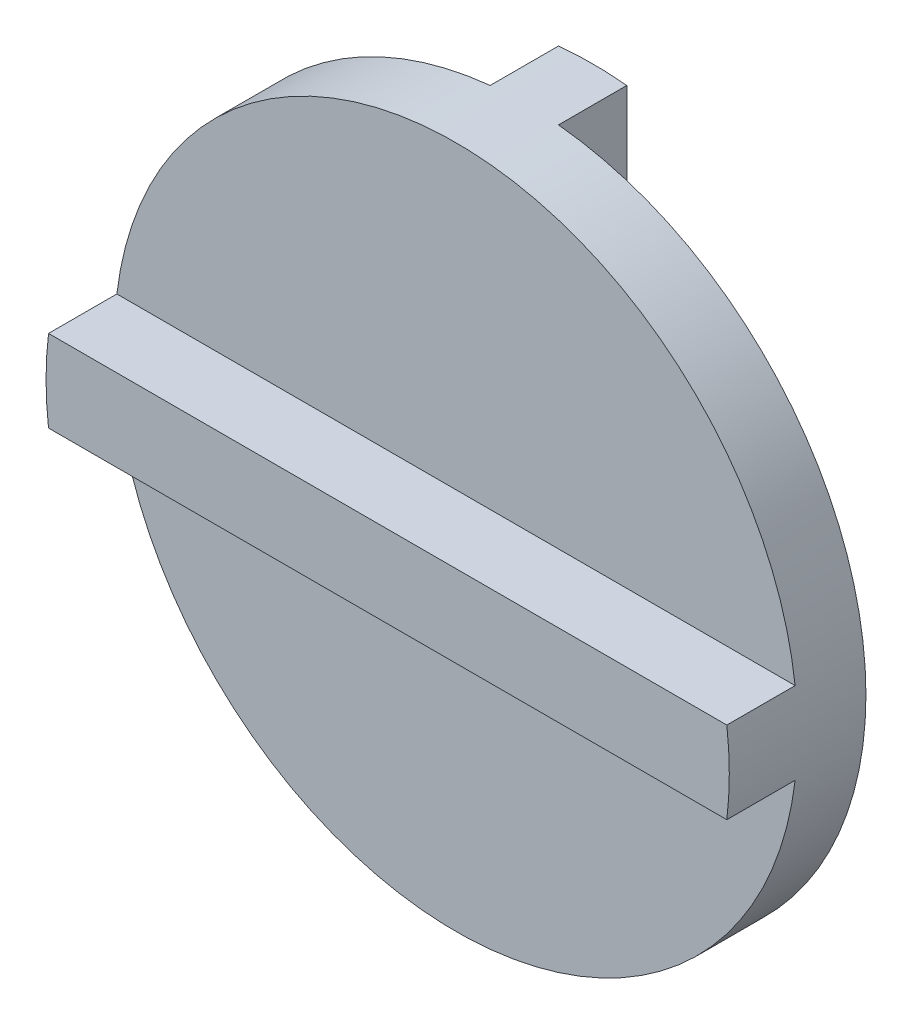
ISO-10303-21;
HEADER;
FILE_DESCRIPTION(('STEP AP214'),'2;1');
FILE_NAME('part.step','',(''),(''),'','','');
FILE_SCHEMA(('AUTOMOTIVE_DESIGN { 1 0 10303 214 1 1 1 1 }'));
ENDSEC;
DATA;
#1=APPLICATION_CONTEXT('core data for automotive mechanical design processes');
#2=APPLICATION_PROTOCOL_DEFINITION('international standard','automotive_design',2000,#1);
#3=PRODUCT_CONTEXT('',#1,'mechanical');
#4=PRODUCT('Part','Part','',(#3));
#5=PRODUCT_RELATED_PRODUCT_CATEGORY('part','',(#4));
#6=PRODUCT_DEFINITION_FORMATION('','',#4);
#7=PRODUCT_DEFINITION_CONTEXT('part definition',#1,'design');
#8=PRODUCT_DEFINITION('design','',#6,#7);
#9=PRODUCT_DEFINITION_SHAPE('','',#8);
#10=(LENGTH_UNIT() NAMED_UNIT(*) SI_UNIT(.MILLI.,.METRE.));
#11=(NAMED_UNIT(*) PLANE_ANGLE_UNIT() SI_UNIT($,.RADIAN.));
#12=(NAMED_UNIT(*) SI_UNIT($,.STERADIAN.) SOLID_ANGLE_UNIT());
#13=UNCERTAINTY_MEASURE_WITH_UNIT(LENGTH_MEASURE(1.E-05),#10,'distance_accuracy_value','');
#14=(GEOMETRIC_REPRESENTATION_CONTEXT(3) GLOBAL_UNCERTAINTY_ASSIGNED_CONTEXT((#13)) GLOBAL_UNIT_ASSIGNED_CONTEXT((#10,
#11,#12)) REPRESENTATION_CONTEXT('',''));
#15=CARTESIAN_POINT('',(0.,0.,0.));
#16=DIRECTION('',(0.,0.,1.));
#17=DIRECTION('',(1.,0.,0.));
#18=AXIS2_PLACEMENT_3D('',#15,#16,#17);
#19=CARTESIAN_POINT('',(0.,0.,0.));
#20=DIRECTION('',(0.,0.,1.));
#21=DIRECTION('',(1.,0.,0.));
#22=AXIS2_PLACEMENT_3D('',#19,#20,#21);
#23=PLANE('',#22);
#24=DIRECTION('',(0.,1.,0.));
#25=VECTOR('',#24,1.);
#26=CARTESIAN_POINT('',(-5.,49.749371855331,0.));
#27=LINE('',#26,#25);
#28=CARTESIAN_POINT('',(-5.,-49.749371855331,0.));
#29=VERTEX_POINT('',#28);
#30=CARTESIAN_POINT('',(-5.,49.749371855331,0.));
#31=VERTEX_POINT('',#30);
#32=EDGE_CURVE('E55',#29,#31,#27,.T.);
#33=ORIENTED_EDGE('',*,*,#32,.F.);
#34=CARTESIAN_POINT('',(0.,0.,0.));
#35=DIRECTION('',(0.,0.,1.));
#36=DIRECTION('',(1.,0.,0.));
#37=AXIS2_PLACEMENT_3D('',#34,#35,#36);
#38=CIRCLE('',#37,50.);
#39=EDGE_CURVE('E58',#31,#29,#38,.T.);
#40=ORIENTED_EDGE('',*,*,#39,.F.);
#41=EDGE_LOOP('',(#33,#40));
#42=FACE_BOUND('',#41,.T.);
#43=ADVANCED_FACE('F39',(#42),#23,.F.);
#44=DIRECTION('',(0.,-1.,0.));
#45=VECTOR('',#44,1.);
#46=CARTESIAN_POINT('',(5.,49.749371855331,0.));
#47=LINE('',#46,#45);
#48=CARTESIAN_POINT('',(5.,49.749371855331,0.));
#49=VERTEX_POINT('',#48);
#50=CARTESIAN_POINT('',(5.,-49.749371855331,0.));
#51=VERTEX_POINT('',#50);
#52=EDGE_CURVE('E296',#49,#51,#47,.T.);
#53=ORIENTED_EDGE('',*,*,#52,.F.);
#54=EDGE_CURVE('E43',#51,#49,#38,.T.);
#55=ORIENTED_EDGE('',*,*,#54,.F.);
#56=EDGE_LOOP('',(#53,#55));
#57=FACE_BOUND('',#56,.T.);
#58=ADVANCED_FACE('F195',(#57),#23,.F.);
#59=CARTESIAN_POINT('',(0.,0.,10.));
#60=DIRECTION('',(0.,0.,1.));
#61=DIRECTION('',(1.,0.,0.));
#62=AXIS2_PLACEMENT_3D('',#59,#60,#61);
#63=PLANE('',#62);
#64=CARTESIAN_POINT('',(0.,0.,10.));
#65=DIRECTION('',(0.,0.,1.));
#66=DIRECTION('',(1.,0.,0.));
#67=AXIS2_PLACEMENT_3D('',#64,#65,#66);
#68=CIRCLE('',#67,50.);
#69=CARTESIAN_POINT('',(49.6386945839634,6.,10.));
#70=VERTEX_POINT('',#69);
#71=CARTESIAN_POINT('',(-49.6386945839634,6.,10.));
#72=VERTEX_POINT('',#71);
#73=EDGE_CURVE('E11',#70,#72,#68,.T.);
#74=ORIENTED_EDGE('',*,*,#73,.T.);
#75=DIRECTION('',(1.,0.,0.));
#76=VECTOR('',#75,1.);
#77=CARTESIAN_POINT('',(-49.6386945839634,6.,10.));
#78=LINE('',#77,#76);
#79=EDGE_CURVE('E132',#72,#70,#78,.T.);
#80=ORIENTED_EDGE('',*,*,#79,.T.);
#81=EDGE_LOOP('',(#74,#80));
#82=FACE_BOUND('',#81,.T.);
#83=ADVANCED_FACE('F193',(#82),#63,.T.);
#84=CARTESIAN_POINT('',(0.,0.,10.));
#85=DIRECTION('',(0.,0.,-1.));
#86=DIRECTION('',(-1.,0.,0.));
#87=AXIS2_PLACEMENT_3D('',#84,#85,#86);
#88=CYLINDRICAL_SURFACE('',#87,50.);
#89=ORIENTED_EDGE('',*,*,#73,.F.);
#90=DIRECTION('',(0.,0.,-1.));
#91=VECTOR('',#90,1.);
#92=CARTESIAN_POINT('',(49.6386945839634,6.,20.));
#93=LINE('',#92,#91);
#94=CARTESIAN_POINT('',(49.6386945839634,6.,20.));
#95=VERTEX_POINT('',#94);
#96=EDGE_CURVE('E158',#95,#70,#93,.T.);
#97=ORIENTED_EDGE('',*,*,#96,.F.);
#98=CARTESIAN_POINT('',(0.,0.,20.));
#99=DIRECTION('',(0.,0.,1.));
#100=DIRECTION('',(1.,0.,0.));
#101=AXIS2_PLACEMENT_3D('',#98,#99,#100);
#102=CIRCLE('',#101,50.);
#103=CARTESIAN_POINT('',(49.6386945839634,-6.00000000000001,20.));
#104=VERTEX_POINT('',#103);
#105=EDGE_CURVE('E145',#104,#95,#102,.T.);
#106=ORIENTED_EDGE('',*,*,#105,.F.);
#107=DIRECTION('',(0.,0.,-1.));
#108=VECTOR('',#107,1.);
#109=CARTESIAN_POINT('',(49.6386945839634,-6.00000000000001,20.));
#110=LINE('',#109,#108);
#111=CARTESIAN_POINT('',(49.6386945839634,-6.00000000000001,10.));
#112=VERTEX_POINT('',#111);
#113=EDGE_CURVE('E162',#104,#112,#110,.T.);
#114=ORIENTED_EDGE('',*,*,#113,.T.);
#115=CARTESIAN_POINT('',(-49.6386945839634,-6.,10.));
#116=VERTEX_POINT('',#115);
#117=EDGE_CURVE('E49',#116,#112,#68,.T.);
#118=ORIENTED_EDGE('',*,*,#117,.F.);
#119=DIRECTION('',(0.,0.,-1.));
#120=VECTOR('',#119,1.);
#121=CARTESIAN_POINT('',(-49.6386945839634,-6.,20.));
#122=LINE('',#121,#120);
#123=CARTESIAN_POINT('',(-49.6386945839634,-6.,20.));
#124=VERTEX_POINT('',#123);
#125=EDGE_CURVE('E166',#124,#116,#122,.T.);
#126=ORIENTED_EDGE('',*,*,#125,.F.);
#127=CARTESIAN_POINT('',(0.,0.,20.));
#128=DIRECTION('',(0.,0.,1.));
#129=DIRECTION('',(1.,0.,0.));
#130=AXIS2_PLACEMENT_3D('',#127,#128,#129);
#131=CIRCLE('',#130,50.);
#132=CARTESIAN_POINT('',(-49.6386945839634,6.,20.));
#133=VERTEX_POINT('',#132);
#134=EDGE_CURVE('E138',#133,#124,#131,.T.);
#135=ORIENTED_EDGE('',*,*,#134,.F.);
#136=DIRECTION('',(0.,0.,-1.));
#137=VECTOR('',#136,1.);
#138=CARTESIAN_POINT('',(-49.6386945839634,6.,20.));
#139=LINE('',#138,#137);
#140=EDGE_CURVE('E151',#133,#72,#139,.T.);
#141=ORIENTED_EDGE('',*,*,#140,.T.);
#142=EDGE_LOOP('',(#89,#97,#106,#114,#118,#126,#135,#141));
#143=FACE_BOUND('',#142,.T.);
#144=ORIENTED_EDGE('',*,*,#54,.T.);
#145=DIRECTION('',(0.,0.,1.));
#146=VECTOR('',#145,1.);
#147=CARTESIAN_POINT('',(5.,49.749371855331,-10.));
#148=LINE('',#147,#146);
#149=CARTESIAN_POINT('',(5.,49.749371855331,-10.));
#150=VERTEX_POINT('',#149);
#151=EDGE_CURVE('E107',#150,#49,#148,.T.);
#152=ORIENTED_EDGE('',*,*,#151,.F.);
#153=CARTESIAN_POINT('',(0.,0.,-10.));
#154=DIRECTION('',(0.,0.,-1.));
#155=DIRECTION('',(-1.,0.,0.));
#156=AXIS2_PLACEMENT_3D('',#153,#154,#155);
#157=CIRCLE('',#156,50.);
#158=CARTESIAN_POINT('',(-5.,49.749371855331,-10.));
#159=VERTEX_POINT('',#158);
#160=EDGE_CURVE('E114',#159,#150,#157,.T.);
#161=ORIENTED_EDGE('',*,*,#160,.F.);
#162=DIRECTION('',(0.,0.,1.));
#163=VECTOR('',#162,1.);
#164=CARTESIAN_POINT('',(-5.,49.749371855331,-10.));
#165=LINE('',#164,#163);
#166=EDGE_CURVE('E294',#159,#31,#165,.T.);
#167=ORIENTED_EDGE('',*,*,#166,.T.);
#168=ORIENTED_EDGE('',*,*,#39,.T.);
#169=DIRECTION('',(0.,0.,1.));
#170=VECTOR('',#169,1.);
#171=CARTESIAN_POINT('',(-4.99999999999999,-49.749371855331,-10.));
#172=LINE('',#171,#170);
#173=CARTESIAN_POINT('',(-4.99999999999999,-49.749371855331,-10.));
#174=VERTEX_POINT('',#173);
#175=EDGE_CURVE('E134',#174,#29,#172,.T.);
#176=ORIENTED_EDGE('',*,*,#175,.F.);
#177=CARTESIAN_POINT('',(0.,0.,-10.));
#178=DIRECTION('',(0.,0.,-1.));
#179=DIRECTION('',(-1.,0.,0.));
#180=AXIS2_PLACEMENT_3D('',#177,#178,#179);
#181=CIRCLE('',#180,50.);
#182=CARTESIAN_POINT('',(5.,-49.749371855331,-10.));
#183=VERTEX_POINT('',#182);
#184=EDGE_CURVE('E113',#183,#174,#181,.T.);
#185=ORIENTED_EDGE('',*,*,#184,.F.);
#186=DIRECTION('',(0.,0.,1.));
#187=VECTOR('',#186,1.);
#188=CARTESIAN_POINT('',(5.,-49.749371855331,-10.));
#189=LINE('',#188,#187);
#190=EDGE_CURVE('E109',#183,#51,#189,.T.);
#191=ORIENTED_EDGE('',*,*,#190,.T.);
#192=EDGE_LOOP('',(#144,#152,#161,#167,#168,#176,#185,#191));
#193=FACE_BOUND('',#192,.T.);
#194=ADVANCED_FACE('F41',(#143,#193),#88,.T.);
#195=DIRECTION('',(1.,0.,0.));
#196=VECTOR('',#195,1.);
#197=CARTESIAN_POINT('',(-49.6386945839634,-6.,10.));
#198=LINE('',#197,#196);
#199=EDGE_CURVE('E127',#116,#112,#198,.T.);
#200=ORIENTED_EDGE('',*,*,#199,.F.);
#201=ORIENTED_EDGE('',*,*,#117,.T.);
#202=EDGE_LOOP('',(#200,#201));
#203=FACE_BOUND('',#202,.T.);
#204=ADVANCED_FACE('F178',(#203),#63,.T.);
#205=CARTESIAN_POINT('',(-49.6386945839634,-6.,20.));
#206=DIRECTION('',(0.,1.,0.));
#207=DIRECTION('',(0.,0.,1.));
#208=AXIS2_PLACEMENT_3D('',#205,#206,#207);
#209=PLANE('',#208);
#210=ORIENTED_EDGE('',*,*,#199,.T.);
#211=ORIENTED_EDGE('',*,*,#113,.F.);
#212=DIRECTION('',(1.,0.,0.));
#213=VECTOR('',#212,1.);
#214=CARTESIAN_POINT('',(-49.6386945839634,-6.,20.));
#215=LINE('',#214,#213);
#216=EDGE_CURVE('E142',#124,#104,#215,.T.);
#217=ORIENTED_EDGE('',*,*,#216,.F.);
#218=ORIENTED_EDGE('',*,*,#125,.T.);
#219=EDGE_LOOP('',(#210,#211,#217,#218));
#220=FACE_BOUND('',#219,.T.);
#221=ADVANCED_FACE('F181',(#220),#209,.F.);
#222=CARTESIAN_POINT('',(-49.6386945839634,6.,20.));
#223=DIRECTION('',(0.,1.,0.));
#224=DIRECTION('',(0.,0.,1.));
#225=AXIS2_PLACEMENT_3D('',#222,#223,#224);
#226=PLANE('',#225);
#227=ORIENTED_EDGE('',*,*,#79,.F.);
#228=ORIENTED_EDGE('',*,*,#140,.F.);
#229=DIRECTION('',(1.,0.,0.));
#230=VECTOR('',#229,1.);
#231=CARTESIAN_POINT('',(-49.6386945839634,6.,20.));
#232=LINE('',#231,#230);
#233=EDGE_CURVE('E148',#133,#95,#232,.T.);
#234=ORIENTED_EDGE('',*,*,#233,.T.);
#235=ORIENTED_EDGE('',*,*,#96,.T.);
#236=EDGE_LOOP('',(#227,#228,#234,#235));
#237=FACE_BOUND('',#236,.T.);
#238=ADVANCED_FACE('F191',(#237),#226,.T.);
#239=CARTESIAN_POINT('',(0.,0.,20.));
#240=DIRECTION('',(0.,0.,1.));
#241=DIRECTION('',(1.,0.,0.));
#242=AXIS2_PLACEMENT_3D('',#239,#240,#241);
#243=PLANE('',#242);
#244=ORIENTED_EDGE('',*,*,#134,.T.);
#245=ORIENTED_EDGE('',*,*,#216,.T.);
#246=ORIENTED_EDGE('',*,*,#105,.T.);
#247=ORIENTED_EDGE('',*,*,#233,.F.);
#248=EDGE_LOOP('',(#244,#245,#246,#247));
#249=FACE_BOUND('',#248,.T.);
#250=ADVANCED_FACE('F187',(#249),#243,.T.);
#251=CARTESIAN_POINT('',(5.,49.749371855331,-10.));
#252=DIRECTION('',(-1.,0.,0.));
#253=DIRECTION('',(0.,0.,1.));
#254=AXIS2_PLACEMENT_3D('',#251,#252,#253);
#255=PLANE('',#254);
#256=ORIENTED_EDGE('',*,*,#52,.T.);
#257=ORIENTED_EDGE('',*,*,#190,.F.);
#258=DIRECTION('',(0.,-1.,0.));
#259=VECTOR('',#258,1.);
#260=CARTESIAN_POINT('',(5.,49.749371855331,-10.));
#261=LINE('',#260,#259);
#262=EDGE_CURVE('E102',#150,#183,#261,.T.);
#263=ORIENTED_EDGE('',*,*,#262,.F.);
#264=ORIENTED_EDGE('',*,*,#151,.T.);
#265=EDGE_LOOP('',(#256,#257,#263,#264));
#266=FACE_BOUND('',#265,.T.);
#267=ADVANCED_FACE('F105',(#266),#255,.F.);
#268=CARTESIAN_POINT('',(-5.,49.749371855331,-10.));
#269=DIRECTION('',(1.,0.,0.));
#270=DIRECTION('',(0.,0.,-1.));
#271=AXIS2_PLACEMENT_3D('',#268,#269,#270);
#272=PLANE('',#271);
#273=ORIENTED_EDGE('',*,*,#32,.T.);
#274=ORIENTED_EDGE('',*,*,#166,.F.);
#275=DIRECTION('',(0.,1.,0.));
#276=VECTOR('',#275,1.);
#277=CARTESIAN_POINT('',(-5.,49.749371855331,-10.));
#278=LINE('',#277,#276);
#279=EDGE_CURVE('E119',#174,#159,#278,.T.);
#280=ORIENTED_EDGE('',*,*,#279,.F.);
#281=ORIENTED_EDGE('',*,*,#175,.T.);
#282=EDGE_LOOP('',(#273,#274,#280,#281));
#283=FACE_BOUND('',#282,.T.);
#284=ADVANCED_FACE('F229',(#283),#272,.F.);
#285=CARTESIAN_POINT('',(0.,0.,-10.));
#286=DIRECTION('',(0.,0.,-1.));
#287=DIRECTION('',(-1.,0.,0.));
#288=AXIS2_PLACEMENT_3D('',#285,#286,#287);
#289=PLANE('',#288);
#290=ORIENTED_EDGE('',*,*,#160,.T.);
#291=ORIENTED_EDGE('',*,*,#262,.T.);
#292=ORIENTED_EDGE('',*,*,#184,.T.);
#293=ORIENTED_EDGE('',*,*,#279,.T.);
#294=EDGE_LOOP('',(#290,#291,#292,#293));
#295=FACE_BOUND('',#294,.T.);
#296=ADVANCED_FACE('F117',(#295),#289,.T.);
#297=CLOSED_SHELL('',(#43,#58,#83,#194,#204,#221,#238,#250,#267,#284,#296));
#298=MANIFOLD_SOLID_BREP('B2',#297);
#299=ADVANCED_BREP_SHAPE_REPRESENTATION('',(#18,#298),#14);
#300=SHAPE_DEFINITION_REPRESENTATION(#9,#299);
ENDSEC;
END-ISO-10303-21;
